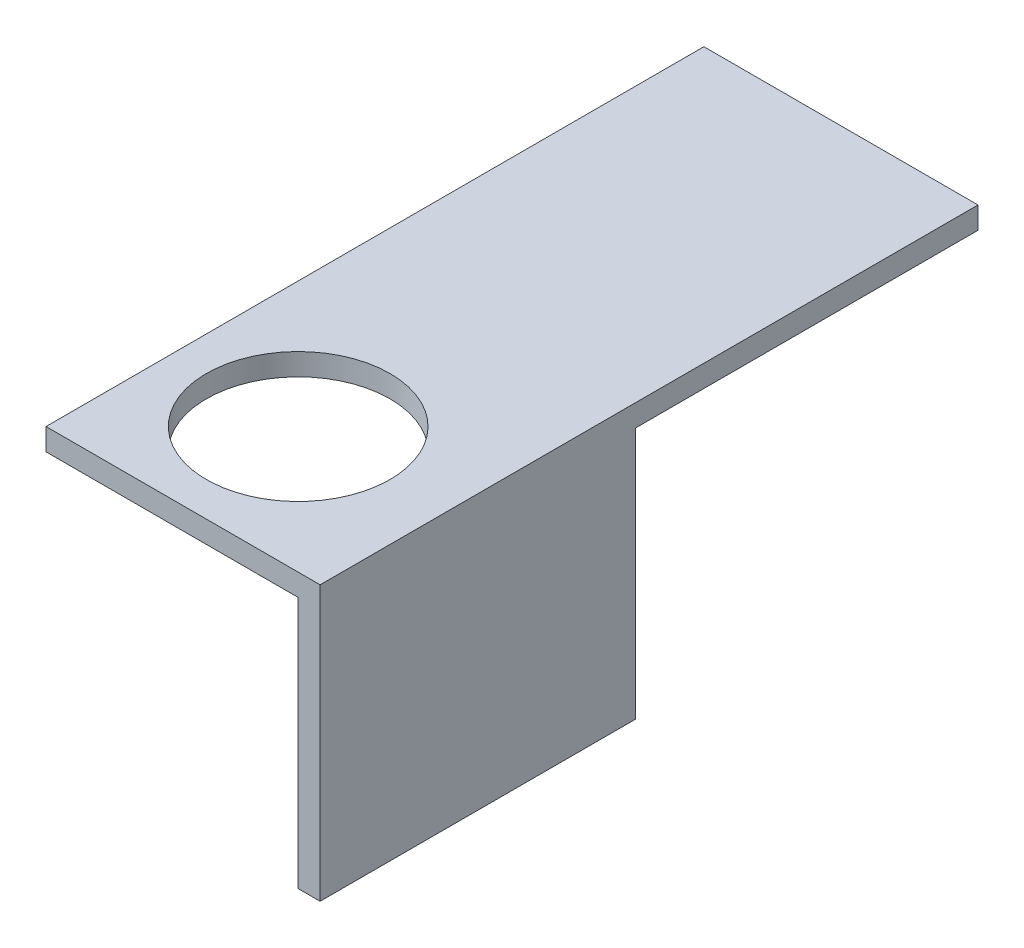
ISO-10303-21;
HEADER;
FILE_DESCRIPTION(('STEP AP214'),'2;1');
FILE_NAME('part.step','',(''),(''),'','','');
FILE_SCHEMA(('AUTOMOTIVE_DESIGN { 1 0 10303 214 1 1 1 1 }'));
ENDSEC;
DATA;
#1=APPLICATION_CONTEXT('core data for automotive mechanical design processes');
#2=APPLICATION_PROTOCOL_DEFINITION('international standard','automotive_design',2000,#1);
#3=PRODUCT_CONTEXT('',#1,'mechanical');
#4=PRODUCT('Part','Part','',(#3));
#5=PRODUCT_RELATED_PRODUCT_CATEGORY('part','',(#4));
#6=PRODUCT_DEFINITION_FORMATION('','',#4);
#7=PRODUCT_DEFINITION_CONTEXT('part definition',#1,'design');
#8=PRODUCT_DEFINITION('design','',#6,#7);
#9=PRODUCT_DEFINITION_SHAPE('','',#8);
#10=(LENGTH_UNIT() NAMED_UNIT(*) SI_UNIT(.MILLI.,.METRE.));
#11=(NAMED_UNIT(*) PLANE_ANGLE_UNIT() SI_UNIT($,.RADIAN.));
#12=(NAMED_UNIT(*) SI_UNIT($,.STERADIAN.) SOLID_ANGLE_UNIT());
#13=UNCERTAINTY_MEASURE_WITH_UNIT(LENGTH_MEASURE(1.E-05),#10,'distance_accuracy_value','');
#14=(GEOMETRIC_REPRESENTATION_CONTEXT(3) GLOBAL_UNCERTAINTY_ASSIGNED_CONTEXT((#13)) GLOBAL_UNIT_ASSIGNED_CONTEXT((#10,
#11,#12)) REPRESENTATION_CONTEXT('',''));
#15=CARTESIAN_POINT('',(0.,0.,0.));
#16=DIRECTION('',(0.,0.,1.));
#17=DIRECTION('',(1.,0.,0.));
#18=AXIS2_PLACEMENT_3D('',#15,#16,#17);
#19=CARTESIAN_POINT('',(-78.6107357461524,40.9639966273187,120.));
#20=DIRECTION('',(1.,0.,0.));
#21=DIRECTION('',(0.,0.,-1.));
#22=AXIS2_PLACEMENT_3D('',#19,#20,#21);
#23=PLANE('',#22);
#24=DIRECTION('',(0.,1.,0.));
#25=VECTOR('',#24,1.);
#26=CARTESIAN_POINT('',(-78.6107357461524,40.9639966273187,62.5));
#27=LINE('',#26,#25);
#28=CARTESIAN_POINT('',(-78.6107357461524,-5.03600337268127,62.5));
#29=VERTEX_POINT('',#28);
#30=CARTESIAN_POINT('',(-78.6107357461524,40.9639966273187,62.5));
#31=VERTEX_POINT('',#30);
#32=EDGE_CURVE('E120',#29,#31,#27,.T.);
#33=ORIENTED_EDGE('',*,*,#32,.F.);
#34=DIRECTION('',(0.,0.,-1.));
#35=VECTOR('',#34,1.);
#36=CARTESIAN_POINT('',(-78.6107357461524,-5.03600337268127,120.));
#37=LINE('',#36,#35);
#38=CARTESIAN_POINT('',(-78.6107357461524,-5.03600337268127,120.));
#39=VERTEX_POINT('',#38);
#40=EDGE_CURVE('E107',#39,#29,#37,.T.);
#41=ORIENTED_EDGE('',*,*,#40,.F.);
#42=DIRECTION('',(0.,-1.,0.));
#43=VECTOR('',#42,1.);
#44=CARTESIAN_POINT('',(-78.6107357461524,40.9639966273187,120.));
#45=LINE('',#44,#43);
#46=CARTESIAN_POINT('',(-78.6107357461524,40.9639966273187,120.));
#47=VERTEX_POINT('',#46);
#48=EDGE_CURVE('E94',#47,#39,#45,.T.);
#49=ORIENTED_EDGE('',*,*,#48,.F.);
#50=DIRECTION('',(0.,0.,-1.));
#51=VECTOR('',#50,1.);
#52=CARTESIAN_POINT('',(-78.6107357461524,40.9639966273187,120.));
#53=LINE('',#52,#51);
#54=EDGE_CURVE('E129',#47,#31,#53,.T.);
#55=ORIENTED_EDGE('',*,*,#54,.T.);
#56=EDGE_LOOP('',(#33,#41,#49,#55));
#57=FACE_BOUND('',#56,.T.);
#58=ADVANCED_FACE('F32',(#57),#23,.F.);
#59=CARTESIAN_POINT('',(-78.6107357461524,-5.03600337268127,120.));
#60=DIRECTION('',(0.,1.,0.));
#61=DIRECTION('',(0.,0.,1.));
#62=AXIS2_PLACEMENT_3D('',#59,#60,#61);
#63=PLANE('',#62);
#64=DIRECTION('',(-1.,0.,0.));
#65=VECTOR('',#64,1.);
#66=CARTESIAN_POINT('',(-52.6107357461524,-5.03600337268127,62.5));
#67=LINE('',#66,#65);
#68=CARTESIAN_POINT('',(-74.6107357461524,-5.03600337268127,62.5));
#69=VERTEX_POINT('',#68);
#70=EDGE_CURVE('E105',#69,#29,#67,.T.);
#71=ORIENTED_EDGE('',*,*,#70,.F.);
#72=DIRECTION('',(0.,0.,-1.));
#73=VECTOR('',#72,1.);
#74=CARTESIAN_POINT('',(-74.6107357461524,-5.03600337268127,120.));
#75=LINE('',#74,#73);
#76=CARTESIAN_POINT('',(-74.6107357461524,-5.03600337268127,120.));
#77=VERTEX_POINT('',#76);
#78=EDGE_CURVE('E101',#77,#69,#75,.T.);
#79=ORIENTED_EDGE('',*,*,#78,.F.);
#80=DIRECTION('',(1.,0.,0.));
#81=VECTOR('',#80,1.);
#82=CARTESIAN_POINT('',(-78.6107357461524,-5.03600337268127,120.));
#83=LINE('',#82,#81);
#84=EDGE_CURVE('E88',#39,#77,#83,.T.);
#85=ORIENTED_EDGE('',*,*,#84,.F.);
#86=ORIENTED_EDGE('',*,*,#40,.T.);
#87=EDGE_LOOP('',(#71,#79,#85,#86));
#88=FACE_BOUND('',#87,.T.);
#89=ADVANCED_FACE('F102',(#88),#63,.F.);
#90=CARTESIAN_POINT('',(-74.6107357461524,44.9639966273187,120.));
#91=DIRECTION('',(-1.,0.,0.));
#92=DIRECTION('',(0.,0.,1.));
#93=AXIS2_PLACEMENT_3D('',#90,#91,#92);
#94=PLANE('',#93);
#95=DIRECTION('',(0.,-1.,0.));
#96=VECTOR('',#95,1.);
#97=CARTESIAN_POINT('',(-74.6107357461524,44.9639966273187,62.5));
#98=LINE('',#97,#96);
#99=CARTESIAN_POINT('',(-74.6107357461524,40.9639966273187,62.5));
#100=VERTEX_POINT('',#99);
#101=EDGE_CURVE('E11',#100,#69,#98,.T.);
#102=ORIENTED_EDGE('',*,*,#101,.F.);
#103=DIRECTION('',(0.,0.,1.));
#104=VECTOR('',#103,1.);
#105=CARTESIAN_POINT('',(-74.6107357461524,40.9639966273188,120.));
#106=LINE('',#105,#104);
#107=CARTESIAN_POINT('',(-74.6107357461524,40.9639966273187,0.));
#108=VERTEX_POINT('',#107);
#109=EDGE_CURVE('E191',#108,#100,#106,.T.);
#110=ORIENTED_EDGE('',*,*,#109,.F.);
#111=DIRECTION('',(0.,1.,0.));
#112=VECTOR('',#111,1.);
#113=CARTESIAN_POINT('',(-74.6107357461524,44.9639966273187,0.));
#114=LINE('',#113,#112);
#115=CARTESIAN_POINT('',(-74.6107357461524,44.9639966273187,0.));
#116=VERTEX_POINT('',#115);
#117=EDGE_CURVE('E65',#108,#116,#114,.T.);
#118=ORIENTED_EDGE('',*,*,#117,.T.);
#119=DIRECTION('',(0.,0.,-1.));
#120=VECTOR('',#119,1.);
#121=CARTESIAN_POINT('',(-74.6107357461524,44.9639966273187,120.));
#122=LINE('',#121,#120);
#123=CARTESIAN_POINT('',(-74.6107357461524,44.9639966273187,120.));
#124=VERTEX_POINT('',#123);
#125=EDGE_CURVE('E108',#124,#116,#122,.T.);
#126=ORIENTED_EDGE('',*,*,#125,.F.);
#127=DIRECTION('',(0.,1.,0.));
#128=VECTOR('',#127,1.);
#129=CARTESIAN_POINT('',(-74.6107357461524,44.9639966273187,120.));
#130=LINE('',#129,#128);
#131=EDGE_CURVE('E92',#77,#124,#130,.T.);
#132=ORIENTED_EDGE('',*,*,#131,.F.);
#133=ORIENTED_EDGE('',*,*,#78,.T.);
#134=EDGE_LOOP('',(#102,#110,#118,#126,#132,#133));
#135=FACE_BOUND('',#134,.T.);
#136=ADVANCED_FACE('F110',(#135),#94,.F.);
#137=CARTESIAN_POINT('',(-124.610735746152,40.9639966273187,0.));
#138=DIRECTION('',(0.,0.,1.));
#139=DIRECTION('',(1.,0.,0.));
#140=AXIS2_PLACEMENT_3D('',#137,#138,#139);
#141=PLANE('',#140);
#142=ORIENTED_EDGE('',*,*,#117,.F.);
#143=DIRECTION('',(1.,0.,0.));
#144=VECTOR('',#143,1.);
#145=CARTESIAN_POINT('',(-124.610735746152,40.9639966273187,0.));
#146=LINE('',#145,#144);
#147=CARTESIAN_POINT('',(-124.610735746152,40.9639966273187,0.));
#148=VERTEX_POINT('',#147);
#149=EDGE_CURVE('E119',#148,#108,#146,.T.);
#150=ORIENTED_EDGE('',*,*,#149,.F.);
#151=DIRECTION('',(0.,-1.,0.));
#152=VECTOR('',#151,1.);
#153=CARTESIAN_POINT('',(-124.610735746152,44.9639966273187,0.));
#154=LINE('',#153,#152);
#155=CARTESIAN_POINT('',(-124.610735746152,44.9639966273187,0.));
#156=VERTEX_POINT('',#155);
#157=EDGE_CURVE('E116',#156,#148,#154,.T.);
#158=ORIENTED_EDGE('',*,*,#157,.F.);
#159=DIRECTION('',(-1.,0.,0.));
#160=VECTOR('',#159,1.);
#161=CARTESIAN_POINT('',(-124.610735746152,44.9639966273187,0.));
#162=LINE('',#161,#160);
#163=EDGE_CURVE('E71',#116,#156,#162,.T.);
#164=ORIENTED_EDGE('',*,*,#163,.F.);
#165=EDGE_LOOP('',(#142,#150,#158,#164));
#166=FACE_BOUND('',#165,.T.);
#167=ADVANCED_FACE('F141',(#166),#141,.F.);
#168=CARTESIAN_POINT('',(-124.610735746152,44.9639966273187,120.));
#169=DIRECTION('',(1.,0.,0.));
#170=DIRECTION('',(0.,0.,-1.));
#171=AXIS2_PLACEMENT_3D('',#168,#169,#170);
#172=PLANE('',#171);
#173=ORIENTED_EDGE('',*,*,#157,.T.);
#174=DIRECTION('',(0.,0.,-1.));
#175=VECTOR('',#174,1.);
#176=CARTESIAN_POINT('',(-124.610735746152,40.9639966273187,120.));
#177=LINE('',#176,#175);
#178=CARTESIAN_POINT('',(-124.610735746152,40.9639966273187,120.));
#179=VERTEX_POINT('',#178);
#180=EDGE_CURVE('E42',#179,#148,#177,.T.);
#181=ORIENTED_EDGE('',*,*,#180,.F.);
#182=DIRECTION('',(0.,-1.,0.));
#183=VECTOR('',#182,1.);
#184=CARTESIAN_POINT('',(-124.610735746152,44.9639966273187,120.));
#185=LINE('',#184,#183);
#186=CARTESIAN_POINT('',(-124.610735746152,44.9639966273187,120.));
#187=VERTEX_POINT('',#186);
#188=EDGE_CURVE('E125',#187,#179,#185,.T.);
#189=ORIENTED_EDGE('',*,*,#188,.F.);
#190=DIRECTION('',(0.,0.,-1.));
#191=VECTOR('',#190,1.);
#192=CARTESIAN_POINT('',(-124.610735746152,44.9639966273187,120.));
#193=LINE('',#192,#191);
#194=EDGE_CURVE('E112',#187,#156,#193,.T.);
#195=ORIENTED_EDGE('',*,*,#194,.T.);
#196=EDGE_LOOP('',(#173,#181,#189,#195));
#197=FACE_BOUND('',#196,.T.);
#198=ADVANCED_FACE('F34',(#197),#172,.F.);
#199=CARTESIAN_POINT('',(-124.610735746152,40.9639966273187,120.));
#200=DIRECTION('',(0.,1.,0.));
#201=DIRECTION('',(0.,0.,1.));
#202=AXIS2_PLACEMENT_3D('',#199,#200,#201);
#203=PLANE('',#202);
#204=CARTESIAN_POINT('',(-101.610735746152,40.9639966273187,97.));
#205=DIRECTION('',(0.,1.,0.));
#206=DIRECTION('',(0.,0.,1.));
#207=AXIS2_PLACEMENT_3D('',#204,#205,#206);
#208=CIRCLE('',#207,16.7528694387805);
#209=CARTESIAN_POINT('',(-101.610735746152,40.9639966273187,80.2471305612195));
#210=VERTEX_POINT('',#209);
#211=EDGE_CURVE('E184',#210,#210,#208,.T.);
#212=ORIENTED_EDGE('',*,*,#211,.T.);
#213=EDGE_LOOP('',(#212));
#214=FACE_BOUND('',#213,.T.);
#215=ORIENTED_EDGE('',*,*,#149,.T.);
#216=ORIENTED_EDGE('',*,*,#109,.T.);
#217=DIRECTION('',(-1.,0.,0.));
#218=VECTOR('',#217,1.);
#219=CARTESIAN_POINT('',(-52.6107357461524,40.9639966273187,62.5));
#220=LINE('',#219,#218);
#221=EDGE_CURVE('E185',#100,#31,#220,.T.);
#222=ORIENTED_EDGE('',*,*,#221,.T.);
#223=ORIENTED_EDGE('',*,*,#54,.F.);
#224=DIRECTION('',(1.,0.,0.));
#225=VECTOR('',#224,1.);
#226=CARTESIAN_POINT('',(-124.610735746152,40.9639966273187,120.));
#227=LINE('',#226,#225);
#228=EDGE_CURVE('E79',#179,#47,#227,.T.);
#229=ORIENTED_EDGE('',*,*,#228,.F.);
#230=ORIENTED_EDGE('',*,*,#180,.T.);
#231=EDGE_LOOP('',(#215,#216,#222,#223,#229,#230));
#232=FACE_BOUND('',#231,.T.);
#233=ADVANCED_FACE('F134',(#214,#232),#203,.F.);
#234=CARTESIAN_POINT('',(-124.610735746152,44.9639966273187,120.));
#235=DIRECTION('',(0.,-1.,0.));
#236=DIRECTION('',(0.,0.,-1.));
#237=AXIS2_PLACEMENT_3D('',#234,#235,#236);
#238=PLANE('',#237);
#239=CARTESIAN_POINT('',(-101.610735746152,44.9639966273187,97.));
#240=DIRECTION('',(0.,-1.,0.));
#241=DIRECTION('',(0.,0.,-1.));
#242=AXIS2_PLACEMENT_3D('',#239,#240,#241);
#243=CIRCLE('',#242,16.7528694387805);
#244=CARTESIAN_POINT('',(-101.610735746152,44.9639966273187,80.2471305612195));
#245=VERTEX_POINT('',#244);
#246=EDGE_CURVE('E36',#245,#245,#243,.T.);
#247=ORIENTED_EDGE('',*,*,#246,.T.);
#248=EDGE_LOOP('',(#247));
#249=FACE_BOUND('',#248,.T.);
#250=ORIENTED_EDGE('',*,*,#163,.T.);
#251=ORIENTED_EDGE('',*,*,#194,.F.);
#252=DIRECTION('',(-1.,0.,0.));
#253=VECTOR('',#252,1.);
#254=CARTESIAN_POINT('',(-124.610735746152,44.9639966273187,120.));
#255=LINE('',#254,#253);
#256=EDGE_CURVE('E50',#124,#187,#255,.T.);
#257=ORIENTED_EDGE('',*,*,#256,.F.);
#258=ORIENTED_EDGE('',*,*,#125,.T.);
#259=EDGE_LOOP('',(#250,#251,#257,#258));
#260=FACE_BOUND('',#259,.T.);
#261=ADVANCED_FACE('F142',(#249,#260),#238,.F.);
#262=CARTESIAN_POINT('',(-124.610735746152,40.9639966273187,120.));
#263=DIRECTION('',(0.,0.,1.));
#264=DIRECTION('',(1.,0.,0.));
#265=AXIS2_PLACEMENT_3D('',#262,#263,#264);
#266=PLANE('',#265);
#267=ORIENTED_EDGE('',*,*,#188,.T.);
#268=ORIENTED_EDGE('',*,*,#228,.T.);
#269=ORIENTED_EDGE('',*,*,#48,.T.);
#270=ORIENTED_EDGE('',*,*,#84,.T.);
#271=ORIENTED_EDGE('',*,*,#131,.T.);
#272=ORIENTED_EDGE('',*,*,#256,.T.);
#273=EDGE_LOOP('',(#267,#268,#269,#270,#271,#272));
#274=FACE_BOUND('',#273,.T.);
#275=ADVANCED_FACE('F90',(#274),#266,.T.);
#276=CARTESIAN_POINT('',(-52.6107357461524,40.9639966273187,62.5));
#277=DIRECTION('',(0.,0.,-1.));
#278=DIRECTION('',(-1.,0.,0.));
#279=AXIS2_PLACEMENT_3D('',#276,#277,#278);
#280=PLANE('',#279);
#281=ORIENTED_EDGE('',*,*,#32,.T.);
#282=ORIENTED_EDGE('',*,*,#221,.F.);
#283=ORIENTED_EDGE('',*,*,#101,.T.);
#284=ORIENTED_EDGE('',*,*,#70,.T.);
#285=EDGE_LOOP('',(#281,#282,#283,#284));
#286=FACE_BOUND('',#285,.T.);
#287=ADVANCED_FACE('F150',(#286),#280,.T.);
#288=CARTESIAN_POINT('',(-101.610735746152,81.9639966273187,97.));
#289=DIRECTION('',(0.,-1.,0.));
#290=DIRECTION('',(0.,0.,-1.));
#291=AXIS2_PLACEMENT_3D('',#288,#289,#290);
#292=CYLINDRICAL_SURFACE('',#291,16.7528694387805);
#293=CARTESIAN_POINT('',(-101.610735746152,44.9639966273187,80.2471305612195));
#294=CARTESIAN_POINT('',(-101.610735746152,44.9223299606521,80.2471305612195));
#295=CARTESIAN_POINT('',(-101.610735746152,44.8806632939854,80.2471305612195));
#296=CARTESIAN_POINT('',(-101.610735746152,44.7973299606521,80.2471305612195));
#297=CARTESIAN_POINT('',(-101.610735746152,44.7556632939854,80.2471305612195));
#298=CARTESIAN_POINT('',(-101.610735746152,44.6723299606521,80.2471305612195));
#299=CARTESIAN_POINT('',(-101.610735746152,44.6306632939854,80.2471305612195));
#300=CARTESIAN_POINT('',(-101.610735746152,44.5473299606521,80.2471305612195));
#301=CARTESIAN_POINT('',(-101.610735746152,44.5056632939854,80.2471305612195));
#302=CARTESIAN_POINT('',(-101.610735746152,44.4223299606521,80.2471305612195));
#303=CARTESIAN_POINT('',(-101.610735746152,44.3806632939854,80.2471305612195));
#304=CARTESIAN_POINT('',(-101.610735746152,44.2973299606521,80.2471305612195));
#305=CARTESIAN_POINT('',(-101.610735746152,44.2556632939854,80.2471305612195));
#306=CARTESIAN_POINT('',(-101.610735746152,44.1723299606521,80.2471305612195));
#307=CARTESIAN_POINT('',(-101.610735746152,44.1306632939854,80.2471305612195));
#308=CARTESIAN_POINT('',(-101.610735746152,44.0473299606521,80.2471305612195));
#309=CARTESIAN_POINT('',(-101.610735746152,44.0056632939854,80.2471305612195));
#310=CARTESIAN_POINT('',(-101.610735746152,43.9223299606521,80.2471305612195));
#311=CARTESIAN_POINT('',(-101.610735746152,43.8806632939854,80.2471305612195));
#312=CARTESIAN_POINT('',(-101.610735746152,43.7973299606521,80.2471305612195));
#313=CARTESIAN_POINT('',(-101.610735746152,43.7556632939854,80.2471305612195));
#314=CARTESIAN_POINT('',(-101.610735746152,43.6723299606521,80.2471305612195));
#315=CARTESIAN_POINT('',(-101.610735746152,43.6306632939854,80.2471305612195));
#316=CARTESIAN_POINT('',(-101.610735746152,43.5473299606521,80.2471305612195));
#317=CARTESIAN_POINT('',(-101.610735746152,43.5056632939854,80.2471305612195));
#318=CARTESIAN_POINT('',(-101.610735746152,43.4223299606521,80.2471305612195));
#319=CARTESIAN_POINT('',(-101.610735746152,43.3806632939854,80.2471305612195));
#320=CARTESIAN_POINT('',(-101.610735746152,43.2973299606521,80.2471305612195));
#321=CARTESIAN_POINT('',(-101.610735746152,43.2556632939854,80.2471305612195));
#322=CARTESIAN_POINT('',(-101.610735746152,43.1723299606521,80.2471305612195));
#323=CARTESIAN_POINT('',(-101.610735746152,43.1306632939854,80.2471305612195));
#324=CARTESIAN_POINT('',(-101.610735746152,43.0473299606521,80.2471305612195));
#325=CARTESIAN_POINT('',(-101.610735746152,43.0056632939854,80.2471305612195));
#326=CARTESIAN_POINT('',(-101.610735746152,42.9223299606521,80.2471305612195));
#327=CARTESIAN_POINT('',(-101.610735746152,42.8806632939854,80.2471305612195));
#328=CARTESIAN_POINT('',(-101.610735746152,42.7973299606521,80.2471305612195));
#329=CARTESIAN_POINT('',(-101.610735746152,42.7556632939854,80.2471305612195));
#330=CARTESIAN_POINT('',(-101.610735746152,42.6723299606521,80.2471305612195));
#331=CARTESIAN_POINT('',(-101.610735746152,42.6306632939854,80.2471305612195));
#332=CARTESIAN_POINT('',(-101.610735746152,42.5473299606521,80.2471305612195));
#333=CARTESIAN_POINT('',(-101.610735746152,42.5056632939854,80.2471305612195));
#334=CARTESIAN_POINT('',(-101.610735746152,42.4223299606521,80.2471305612195));
#335=CARTESIAN_POINT('',(-101.610735746152,42.3806632939854,80.2471305612195));
#336=CARTESIAN_POINT('',(-101.610735746152,42.2973299606521,80.2471305612195));
#337=CARTESIAN_POINT('',(-101.610735746152,42.2556632939854,80.2471305612195));
#338=CARTESIAN_POINT('',(-101.610735746152,42.1723299606521,80.2471305612195));
#339=CARTESIAN_POINT('',(-101.610735746152,42.1306632939854,80.2471305612195));
#340=CARTESIAN_POINT('',(-101.610735746152,42.0473299606521,80.2471305612195));
#341=CARTESIAN_POINT('',(-101.610735746152,42.0056632939854,80.2471305612195));
#342=CARTESIAN_POINT('',(-101.610735746152,41.922329960652,80.2471305612195));
#343=CARTESIAN_POINT('',(-101.610735746152,41.8806632939854,80.2471305612195));
#344=CARTESIAN_POINT('',(-101.610735746152,41.797329960652,80.2471305612195));
#345=CARTESIAN_POINT('',(-101.610735746152,41.7556632939854,80.2471305612195));
#346=CARTESIAN_POINT('',(-101.610735746152,41.672329960652,80.2471305612195));
#347=CARTESIAN_POINT('',(-101.610735746152,41.6306632939854,80.2471305612195));
#348=CARTESIAN_POINT('',(-101.610735746152,41.547329960652,80.2471305612195));
#349=CARTESIAN_POINT('',(-101.610735746152,41.5056632939854,80.2471305612195));
#350=CARTESIAN_POINT('',(-101.610735746152,41.422329960652,80.2471305612195));
#351=CARTESIAN_POINT('',(-101.610735746152,41.3806632939854,80.2471305612195));
#352=CARTESIAN_POINT('',(-101.610735746152,41.297329960652,80.2471305612195));
#353=CARTESIAN_POINT('',(-101.610735746152,41.2556632939854,80.2471305612195));
#354=CARTESIAN_POINT('',(-101.610735746152,41.172329960652,80.2471305612195));
#355=CARTESIAN_POINT('',(-101.610735746152,41.1306632939854,80.2471305612195));
#356=CARTESIAN_POINT('',(-101.610735746152,41.047329960652,80.2471305612195));
#357=CARTESIAN_POINT('',(-101.610735746152,41.0056632939854,80.2471305612195));
#358=CARTESIAN_POINT('',(-101.610735746152,40.9639966273187,80.2471305612195));
#359=B_SPLINE_CURVE_WITH_KNOTS('',3,(#293,#294,#295,#296,#297,#298,#299,#300,#301,#302,#303,
#304,#305,#306,#307,#308,#309,#310,#311,#312,#313,#314,#315,#316,#317,#318,#319,#320,#321,#322,
#323,#324,#325,#326,#327,#328,#329,#330,#331,#332,#333,#334,#335,#336,#337,#338,#339,#340,#341,
#342,#343,#344,#345,#346,#347,#348,#349,#350,#351,#352,#353,#354,#355,#356,#357,#358),
.UNSPECIFIED.,.F.,.F.,(4,2,2,2,2,2,2,2,2,2,2,2,2,2,2,2,2,2,2,2,2,2,2,2,2,2,2,2,2,2,2,2,4),(0.,
0.125,0.25,0.375,0.5,0.625000000000001,0.750000000000001,0.875000000000001,1.,1.12500000000001,
1.25000000000001,1.37500000000001,1.50000000000001,1.62500000000001,1.75000000000001,
1.87500000000001,2.00000000000001,2.12500000000001,2.25000000000001,2.37500000000001,
2.50000000000001,2.62500000000001,2.75000000000001,2.87500000000001,3.00000000000002,
3.12500000000002,3.25000000000002,3.37500000000002,3.50000000000002,3.62500000000002,
3.75000000000002,3.87500000000002,4.00000000000002),.UNSPECIFIED.);
#360=EDGE_CURVE('BSEAM174',#245,#210,#359,.T.);
#361=ORIENTED_EDGE('',*,*,#246,.F.);
#362=ORIENTED_EDGE('',*,*,#211,.F.);
#363=ORIENTED_EDGE('',*,*,#360,.T.);
#364=ORIENTED_EDGE('',*,*,#360,.F.);
#365=EDGE_LOOP('',(#361,#363,#362,#364));
#366=FACE_BOUND('',#365,.T.);
#367=ADVANCED_FACE('F174',(#366),#292,.F.);
#368=CLOSED_SHELL('',(#58,#89,#136,#167,#198,#233,#261,#275,#287,#367));
#369=MANIFOLD_SOLID_BREP('B2',#368);
#370=ADVANCED_BREP_SHAPE_REPRESENTATION('',(#18,#369),#14);
#371=SHAPE_DEFINITION_REPRESENTATION(#9,#370);
ENDSEC;
END-ISO-10303-21;
